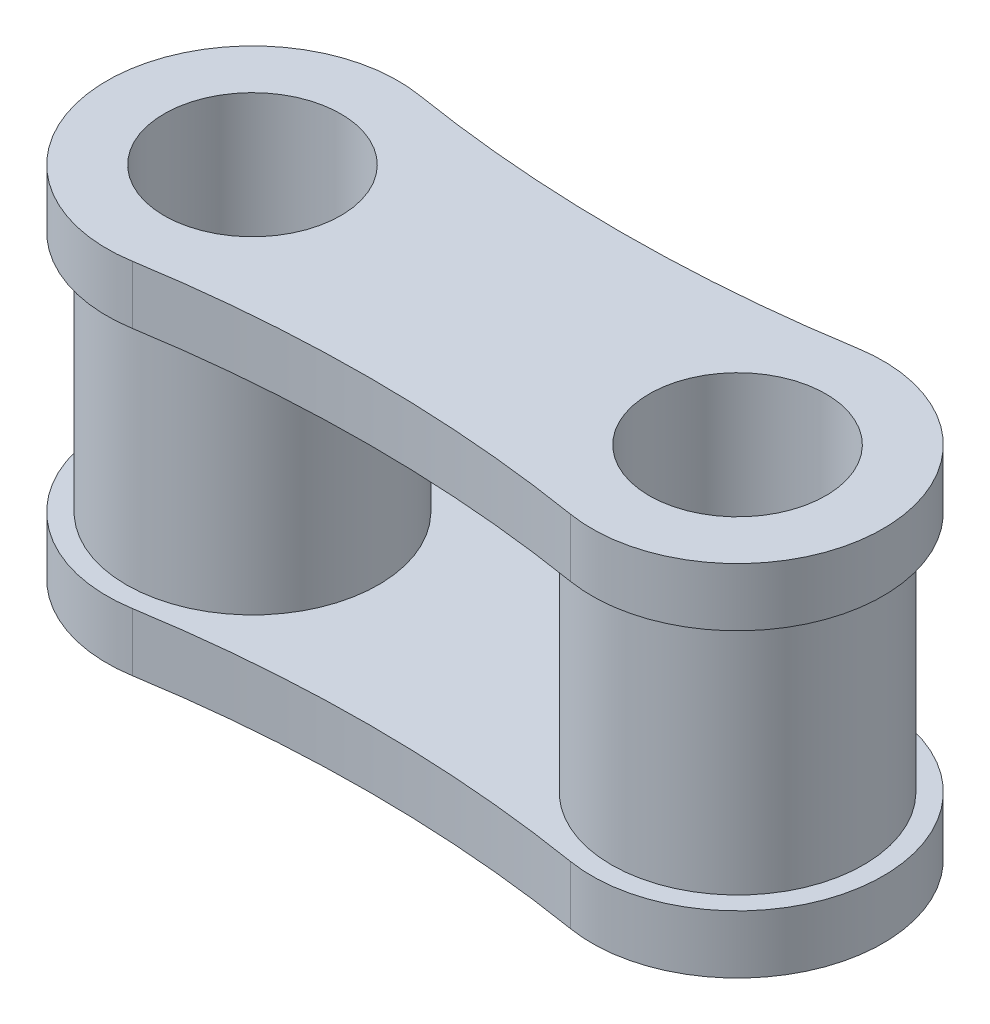
ISO-10303-21;
HEADER;
FILE_DESCRIPTION(('STEP AP214'),'2;1');
FILE_NAME('part.step','',(''),(''),'','','');
FILE_SCHEMA(('AUTOMOTIVE_DESIGN { 1 0 10303 214 1 1 1 1 }'));
ENDSEC;
DATA;
#1=APPLICATION_CONTEXT('core data for automotive mechanical design processes');
#2=APPLICATION_PROTOCOL_DEFINITION('international standard','automotive_design',2000,#1);
#3=PRODUCT_CONTEXT('',#1,'mechanical');
#4=PRODUCT('Part','Part','',(#3));
#5=PRODUCT_RELATED_PRODUCT_CATEGORY('part','',(#4));
#6=PRODUCT_DEFINITION_FORMATION('','',#4);
#7=PRODUCT_DEFINITION_CONTEXT('part definition',#1,'design');
#8=PRODUCT_DEFINITION('design','',#6,#7);
#9=PRODUCT_DEFINITION_SHAPE('','',#8);
#10=(LENGTH_UNIT() NAMED_UNIT(*) SI_UNIT(.MILLI.,.METRE.));
#11=(NAMED_UNIT(*) PLANE_ANGLE_UNIT() SI_UNIT($,.RADIAN.));
#12=(NAMED_UNIT(*) SI_UNIT($,.STERADIAN.) SOLID_ANGLE_UNIT());
#13=UNCERTAINTY_MEASURE_WITH_UNIT(LENGTH_MEASURE(1.E-05),#10,'distance_accuracy_value','');
#14=(GEOMETRIC_REPRESENTATION_CONTEXT(3) GLOBAL_UNCERTAINTY_ASSIGNED_CONTEXT((#13)) GLOBAL_UNIT_ASSIGNED_CONTEXT((#10,
#11,#12)) REPRESENTATION_CONTEXT('',''));
#15=CARTESIAN_POINT('',(0.,0.,0.));
#16=DIRECTION('',(0.,0.,1.));
#17=DIRECTION('',(1.,0.,0.));
#18=AXIS2_PLACEMENT_3D('',#15,#16,#17);
#19=CARTESIAN_POINT('',(0.,0.762,19.4272643467885));
#20=DIRECTION('',(0.,-1.,0.));
#21=DIRECTION('',(0.,0.,-1.));
#22=AXIS2_PLACEMENT_3D('',#19,#20,#21);
#23=CYLINDRICAL_SURFACE('',#22,17.78);
#24=CARTESIAN_POINT('',(0.,0.,19.4272643467885));
#25=DIRECTION('',(0.,-1.,0.));
#26=DIRECTION('',(0.,0.,1.));
#27=AXIS2_PLACEMENT_3D('',#24,#25,#26);
#28=CIRCLE('',#27,17.78);
#29=CARTESIAN_POINT('',(-2.86774193548387,0.,1.88005784001179));
#30=VERTEX_POINT('',#29);
#31=CARTESIAN_POINT('',(2.86774193548387,0.,1.88005784001179));
#32=VERTEX_POINT('',#31);
#33=EDGE_CURVE('E162',#30,#32,#28,.T.);
#34=ORIENTED_EDGE('',*,*,#33,.T.);
#35=DIRECTION('',(0.,-1.,0.));
#36=VECTOR('',#35,1.);
#37=CARTESIAN_POINT('',(2.86774193548387,0.762,1.88005784001179));
#38=LINE('',#37,#36);
#39=CARTESIAN_POINT('',(2.86774193548387,0.762,1.88005784001179));
#40=VERTEX_POINT('',#39);
#41=EDGE_CURVE('E11',#40,#32,#38,.T.);
#42=ORIENTED_EDGE('',*,*,#41,.F.);
#43=CARTESIAN_POINT('',(0.,0.762,19.4272643467885));
#44=DIRECTION('',(0.,-1.,0.));
#45=DIRECTION('',(0.,0.,1.));
#46=AXIS2_PLACEMENT_3D('',#43,#44,#45);
#47=CIRCLE('',#46,17.78);
#48=CARTESIAN_POINT('',(-2.86774193548387,0.762,1.88005784001179));
#49=VERTEX_POINT('',#48);
#50=EDGE_CURVE('E166',#49,#40,#47,.T.);
#51=ORIENTED_EDGE('',*,*,#50,.F.);
#52=DIRECTION('',(0.,-1.,0.));
#53=VECTOR('',#52,1.);
#54=CARTESIAN_POINT('',(-2.86774193548387,0.762,1.88005784001179));
#55=LINE('',#54,#53);
#56=EDGE_CURVE('E176',#49,#30,#55,.T.);
#57=ORIENTED_EDGE('',*,*,#56,.T.);
#58=EDGE_LOOP('',(#34,#42,#51,#57));
#59=FACE_BOUND('',#58,.T.);
#60=ADVANCED_FACE('F40',(#59),#23,.F.);
#61=CARTESIAN_POINT('',(3.175,0.762,0.));
#62=DIRECTION('',(0.,-1.,0.));
#63=DIRECTION('',(0.,0.,-1.));
#64=AXIS2_PLACEMENT_3D('',#61,#62,#63);
#65=CYLINDRICAL_SURFACE('',#64,1.905);
#66=CARTESIAN_POINT('',(3.175,0.,0.));
#67=DIRECTION('',(0.,1.,0.));
#68=DIRECTION('',(0.,0.,1.));
#69=AXIS2_PLACEMENT_3D('',#66,#67,#68);
#70=CIRCLE('',#69,1.905);
#71=CARTESIAN_POINT('',(2.86774193548387,0.,-1.88005784001179));
#72=VERTEX_POINT('',#71);
#73=EDGE_CURVE('E180',#32,#72,#70,.T.);
#74=ORIENTED_EDGE('',*,*,#73,.T.);
#75=DIRECTION('',(0.,-1.,0.));
#76=VECTOR('',#75,1.);
#77=CARTESIAN_POINT('',(2.86774193548387,0.762,-1.88005784001179));
#78=LINE('',#77,#76);
#79=CARTESIAN_POINT('',(2.86774193548387,0.762,-1.88005784001179));
#80=VERTEX_POINT('',#79);
#81=EDGE_CURVE('E49',#80,#72,#78,.T.);
#82=ORIENTED_EDGE('',*,*,#81,.F.);
#83=CARTESIAN_POINT('',(3.175,0.762,0.));
#84=DIRECTION('',(0.,1.,0.));
#85=DIRECTION('',(0.,0.,1.));
#86=AXIS2_PLACEMENT_3D('',#83,#84,#85);
#87=CIRCLE('',#86,1.905);
#88=EDGE_CURVE('E88',#40,#80,#87,.T.);
#89=ORIENTED_EDGE('',*,*,#88,.F.);
#90=ORIENTED_EDGE('',*,*,#41,.T.);
#91=EDGE_LOOP('',(#74,#82,#89,#90));
#92=FACE_BOUND('',#91,.T.);
#93=ADVANCED_FACE('F210',(#92),#65,.T.);
#94=CARTESIAN_POINT('',(0.,0.762,-19.4272643467885));
#95=DIRECTION('',(0.,-1.,0.));
#96=DIRECTION('',(0.,0.,-1.));
#97=AXIS2_PLACEMENT_3D('',#94,#95,#96);
#98=CYLINDRICAL_SURFACE('',#97,17.78);
#99=CARTESIAN_POINT('',(0.,0.,-19.4272643467885));
#100=DIRECTION('',(0.,-1.,0.));
#101=DIRECTION('',(0.,0.,1.));
#102=AXIS2_PLACEMENT_3D('',#99,#100,#101);
#103=CIRCLE('',#102,17.78);
#104=CARTESIAN_POINT('',(-2.86774193548387,0.,-1.88005784001179));
#105=VERTEX_POINT('',#104);
#106=EDGE_CURVE('E75',#72,#105,#103,.T.);
#107=ORIENTED_EDGE('',*,*,#106,.T.);
#108=DIRECTION('',(0.,-1.,0.));
#109=VECTOR('',#108,1.);
#110=CARTESIAN_POINT('',(-2.86774193548387,0.762,-1.88005784001179));
#111=LINE('',#110,#109);
#112=CARTESIAN_POINT('',(-2.86774193548387,0.762,-1.88005784001179));
#113=VERTEX_POINT('',#112);
#114=EDGE_CURVE('E189',#113,#105,#111,.T.);
#115=ORIENTED_EDGE('',*,*,#114,.F.);
#116=CARTESIAN_POINT('',(0.,0.762,-19.4272643467885));
#117=DIRECTION('',(0.,-1.,0.));
#118=DIRECTION('',(0.,0.,1.));
#119=AXIS2_PLACEMENT_3D('',#116,#117,#118);
#120=CIRCLE('',#119,17.78);
#121=EDGE_CURVE('E171',#80,#113,#120,.T.);
#122=ORIENTED_EDGE('',*,*,#121,.F.);
#123=ORIENTED_EDGE('',*,*,#81,.T.);
#124=EDGE_LOOP('',(#107,#115,#122,#123));
#125=FACE_BOUND('',#124,.T.);
#126=ADVANCED_FACE('F193',(#125),#98,.F.);
#127=CARTESIAN_POINT('',(-3.175,0.762,0.));
#128=DIRECTION('',(0.,-1.,0.));
#129=DIRECTION('',(0.,0.,-1.));
#130=AXIS2_PLACEMENT_3D('',#127,#128,#129);
#131=CYLINDRICAL_SURFACE('',#130,1.905);
#132=CARTESIAN_POINT('',(-3.175,0.,0.));
#133=DIRECTION('',(0.,1.,0.));
#134=DIRECTION('',(0.,0.,1.));
#135=AXIS2_PLACEMENT_3D('',#132,#133,#134);
#136=CIRCLE('',#135,1.905);
#137=EDGE_CURVE('E81',#105,#30,#136,.T.);
#138=ORIENTED_EDGE('',*,*,#137,.T.);
#139=ORIENTED_EDGE('',*,*,#56,.F.);
#140=CARTESIAN_POINT('',(-3.175,0.762,0.));
#141=DIRECTION('',(0.,1.,0.));
#142=DIRECTION('',(0.,0.,1.));
#143=AXIS2_PLACEMENT_3D('',#140,#141,#142);
#144=CIRCLE('',#143,1.905);
#145=EDGE_CURVE('E57',#113,#49,#144,.T.);
#146=ORIENTED_EDGE('',*,*,#145,.F.);
#147=ORIENTED_EDGE('',*,*,#114,.T.);
#148=EDGE_LOOP('',(#138,#139,#146,#147));
#149=FACE_BOUND('',#148,.T.);
#150=ADVANCED_FACE('F200',(#149),#131,.T.);
#151=CARTESIAN_POINT('',(-1.5875,0.762,9.71363217339425));
#152=DIRECTION('',(0.,1.,0.));
#153=DIRECTION('',(0.,0.,1.));
#154=AXIS2_PLACEMENT_3D('',#151,#152,#153);
#155=PLANE('',#154);
#156=CARTESIAN_POINT('',(3.175,0.762,0.));
#157=DIRECTION('',(0.,1.,0.));
#158=DIRECTION('',(0.,0.,1.));
#159=AXIS2_PLACEMENT_3D('',#156,#157,#158);
#160=CIRCLE('',#159,1.651);
#161=CARTESIAN_POINT('',(3.175,0.762,1.651));
#162=VERTEX_POINT('',#161);
#163=EDGE_CURVE('E143',#162,#162,#160,.T.);
#164=ORIENTED_EDGE('',*,*,#163,.F.);
#165=EDGE_LOOP('',(#164));
#166=FACE_BOUND('',#165,.T.);
#167=CARTESIAN_POINT('',(-3.175,0.762,0.));
#168=DIRECTION('',(0.,1.,0.));
#169=DIRECTION('',(0.,0.,1.));
#170=AXIS2_PLACEMENT_3D('',#167,#168,#169);
#171=CIRCLE('',#170,1.651);
#172=CARTESIAN_POINT('',(-3.175,0.762,1.651));
#173=VERTEX_POINT('',#172);
#174=EDGE_CURVE('E156',#173,#173,#171,.T.);
#175=ORIENTED_EDGE('',*,*,#174,.F.);
#176=EDGE_LOOP('',(#175));
#177=FACE_BOUND('',#176,.T.);
#178=ORIENTED_EDGE('',*,*,#50,.T.);
#179=ORIENTED_EDGE('',*,*,#88,.T.);
#180=ORIENTED_EDGE('',*,*,#121,.T.);
#181=ORIENTED_EDGE('',*,*,#145,.T.);
#182=EDGE_LOOP('',(#178,#179,#180,#181));
#183=FACE_BOUND('',#182,.T.);
#184=ADVANCED_FACE('F202',(#166,#177,#183),#155,.T.);
#185=CARTESIAN_POINT('',(-1.5875,0.,9.71363217339425));
#186=DIRECTION('',(0.,1.,0.));
#187=DIRECTION('',(0.,0.,1.));
#188=AXIS2_PLACEMENT_3D('',#185,#186,#187);
#189=PLANE('',#188);
#190=CARTESIAN_POINT('',(3.175,0.,0.));
#191=DIRECTION('',(0.,1.,0.));
#192=DIRECTION('',(0.,0.,1.));
#193=AXIS2_PLACEMENT_3D('',#190,#191,#192);
#194=CIRCLE('',#193,1.1557);
#195=CARTESIAN_POINT('',(3.175,0.,1.1557));
#196=VERTEX_POINT('',#195);
#197=EDGE_CURVE('E358',#196,#196,#194,.T.);
#198=ORIENTED_EDGE('',*,*,#197,.T.);
#199=EDGE_LOOP('',(#198));
#200=FACE_BOUND('',#199,.T.);
#201=CARTESIAN_POINT('',(-3.175,0.,0.));
#202=DIRECTION('',(0.,1.,0.));
#203=DIRECTION('',(0.,0.,1.));
#204=AXIS2_PLACEMENT_3D('',#201,#202,#203);
#205=CIRCLE('',#204,1.1557);
#206=CARTESIAN_POINT('',(-3.175,0.,1.1557));
#207=VERTEX_POINT('',#206);
#208=EDGE_CURVE('E350',#207,#207,#205,.T.);
#209=ORIENTED_EDGE('',*,*,#208,.T.);
#210=EDGE_LOOP('',(#209));
#211=FACE_BOUND('',#210,.T.);
#212=ORIENTED_EDGE('',*,*,#33,.F.);
#213=ORIENTED_EDGE('',*,*,#137,.F.);
#214=ORIENTED_EDGE('',*,*,#106,.F.);
#215=ORIENTED_EDGE('',*,*,#73,.F.);
#216=EDGE_LOOP('',(#212,#213,#214,#215));
#217=FACE_BOUND('',#216,.T.);
#218=ADVANCED_FACE('F196',(#200,#211,#217),#189,.F.);
#219=CARTESIAN_POINT('',(-3.175,3.937,0.));
#220=DIRECTION('',(0.,-1.,0.));
#221=DIRECTION('',(0.,0.,-1.));
#222=AXIS2_PLACEMENT_3D('',#219,#220,#221);
#223=CYLINDRICAL_SURFACE('',#222,1.651);
#224=CARTESIAN_POINT('',(-3.175,3.937,0.));
#225=DIRECTION('',(0.,1.,0.));
#226=DIRECTION('',(0.,0.,1.));
#227=AXIS2_PLACEMENT_3D('',#224,#225,#226);
#228=CIRCLE('',#227,1.651);
#229=CARTESIAN_POINT('',(-3.175,3.937,1.651));
#230=VERTEX_POINT('',#229);
#231=EDGE_CURVE('E158',#230,#230,#228,.T.);
#232=ORIENTED_EDGE('',*,*,#231,.F.);
#233=EDGE_LOOP('',(#232));
#234=FACE_BOUND('',#233,.T.);
#235=ORIENTED_EDGE('',*,*,#174,.T.);
#236=EDGE_LOOP('',(#235));
#237=FACE_BOUND('',#236,.T.);
#238=ADVANCED_FACE('F240',(#234,#237),#223,.T.);
#239=CARTESIAN_POINT('',(3.175,3.937,0.));
#240=DIRECTION('',(0.,-1.,0.));
#241=DIRECTION('',(0.,0.,-1.));
#242=AXIS2_PLACEMENT_3D('',#239,#240,#241);
#243=CYLINDRICAL_SURFACE('',#242,1.651);
#244=CARTESIAN_POINT('',(3.175,3.937,0.));
#245=DIRECTION('',(0.,1.,0.));
#246=DIRECTION('',(0.,0.,1.));
#247=AXIS2_PLACEMENT_3D('',#244,#245,#246);
#248=CIRCLE('',#247,1.651);
#249=CARTESIAN_POINT('',(3.175,3.937,1.651));
#250=VERTEX_POINT('',#249);
#251=EDGE_CURVE('E148',#250,#250,#248,.T.);
#252=ORIENTED_EDGE('',*,*,#251,.F.);
#253=EDGE_LOOP('',(#252));
#254=FACE_BOUND('',#253,.T.);
#255=ORIENTED_EDGE('',*,*,#163,.T.);
#256=EDGE_LOOP('',(#255));
#257=FACE_BOUND('',#256,.T.);
#258=ADVANCED_FACE('F245',(#254,#257),#243,.T.);
#259=CARTESIAN_POINT('',(1.5875,3.937,-9.71363217339425));
#260=DIRECTION('',(0.,1.,0.));
#261=DIRECTION('',(0.,0.,1.));
#262=AXIS2_PLACEMENT_3D('',#259,#260,#261);
#263=PLANE('',#262);
#264=ORIENTED_EDGE('',*,*,#231,.T.);
#265=EDGE_LOOP('',(#264));
#266=FACE_BOUND('',#265,.T.);
#267=ORIENTED_EDGE('',*,*,#251,.T.);
#268=EDGE_LOOP('',(#267));
#269=FACE_BOUND('',#268,.T.);
#270=CARTESIAN_POINT('',(3.175,3.937,0.));
#271=DIRECTION('',(0.,1.,0.));
#272=DIRECTION('',(0.,0.,1.));
#273=AXIS2_PLACEMENT_3D('',#270,#271,#272);
#274=CIRCLE('',#273,1.905);
#275=CARTESIAN_POINT('',(2.86774193548387,3.937,1.88005784001179));
#276=VERTEX_POINT('',#275);
#277=CARTESIAN_POINT('',(2.86774193548387,3.937,-1.88005784001179));
#278=VERTEX_POINT('',#277);
#279=EDGE_CURVE('E141',#276,#278,#274,.T.);
#280=ORIENTED_EDGE('',*,*,#279,.F.);
#281=CARTESIAN_POINT('',(0.,3.937,19.4272643467885));
#282=DIRECTION('',(0.,-1.,0.));
#283=DIRECTION('',(0.,0.,1.));
#284=AXIS2_PLACEMENT_3D('',#281,#282,#283);
#285=CIRCLE('',#284,17.78);
#286=CARTESIAN_POINT('',(-2.86774193548387,3.937,1.88005784001179));
#287=VERTEX_POINT('',#286);
#288=EDGE_CURVE('E137',#287,#276,#285,.T.);
#289=ORIENTED_EDGE('',*,*,#288,.F.);
#290=CARTESIAN_POINT('',(-3.175,3.937,0.));
#291=DIRECTION('',(0.,1.,0.));
#292=DIRECTION('',(0.,0.,1.));
#293=AXIS2_PLACEMENT_3D('',#290,#291,#292);
#294=CIRCLE('',#293,1.905);
#295=CARTESIAN_POINT('',(-2.86774193548387,3.937,-1.88005784001179));
#296=VERTEX_POINT('',#295);
#297=EDGE_CURVE('E373',#296,#287,#294,.T.);
#298=ORIENTED_EDGE('',*,*,#297,.F.);
#299=CARTESIAN_POINT('',(0.,3.937,-19.4272643467885));
#300=DIRECTION('',(0.,-1.,0.));
#301=DIRECTION('',(0.,0.,1.));
#302=AXIS2_PLACEMENT_3D('',#299,#300,#301);
#303=CIRCLE('',#302,17.78);
#304=EDGE_CURVE('E370',#278,#296,#303,.T.);
#305=ORIENTED_EDGE('',*,*,#304,.F.);
#306=EDGE_LOOP('',(#280,#289,#298,#305));
#307=FACE_BOUND('',#306,.T.);
#308=ADVANCED_FACE('F256',(#266,#269,#307),#263,.F.);
#309=CARTESIAN_POINT('',(1.5875,4.699,-9.71363217339425));
#310=DIRECTION('',(0.,1.,0.));
#311=DIRECTION('',(0.,0.,1.));
#312=AXIS2_PLACEMENT_3D('',#309,#310,#311);
#313=PLANE('',#312);
#314=CARTESIAN_POINT('',(3.175,4.699,0.));
#315=DIRECTION('',(0.,1.,0.));
#316=DIRECTION('',(0.,0.,1.));
#317=AXIS2_PLACEMENT_3D('',#314,#315,#316);
#318=CIRCLE('',#317,1.1557);
#319=CARTESIAN_POINT('',(3.175,4.699,1.1557));
#320=VERTEX_POINT('',#319);
#321=EDGE_CURVE('E353',#320,#320,#318,.T.);
#322=ORIENTED_EDGE('',*,*,#321,.F.);
#323=EDGE_LOOP('',(#322));
#324=FACE_BOUND('',#323,.T.);
#325=CARTESIAN_POINT('',(-3.175,4.699,0.));
#326=DIRECTION('',(0.,1.,0.));
#327=DIRECTION('',(0.,0.,1.));
#328=AXIS2_PLACEMENT_3D('',#325,#326,#327);
#329=CIRCLE('',#328,1.1557);
#330=CARTESIAN_POINT('',(-3.175,4.699,1.1557));
#331=VERTEX_POINT('',#330);
#332=EDGE_CURVE('E347',#331,#331,#329,.T.);
#333=ORIENTED_EDGE('',*,*,#332,.F.);
#334=EDGE_LOOP('',(#333));
#335=FACE_BOUND('',#334,.T.);
#336=CARTESIAN_POINT('',(3.175,4.699,0.));
#337=DIRECTION('',(0.,1.,0.));
#338=DIRECTION('',(0.,0.,1.));
#339=AXIS2_PLACEMENT_3D('',#336,#337,#338);
#340=CIRCLE('',#339,1.905);
#341=CARTESIAN_POINT('',(2.86774193548387,4.699,1.88005784001179));
#342=VERTEX_POINT('',#341);
#343=CARTESIAN_POINT('',(2.86774193548387,4.699,-1.88005784001179));
#344=VERTEX_POINT('',#343);
#345=EDGE_CURVE('E127',#342,#344,#340,.T.);
#346=ORIENTED_EDGE('',*,*,#345,.T.);
#347=CARTESIAN_POINT('',(0.,4.699,-19.4272643467885));
#348=DIRECTION('',(0.,-1.,0.));
#349=DIRECTION('',(0.,0.,1.));
#350=AXIS2_PLACEMENT_3D('',#347,#348,#349);
#351=CIRCLE('',#350,17.78);
#352=CARTESIAN_POINT('',(-2.86774193548387,4.699,-1.88005784001179));
#353=VERTEX_POINT('',#352);
#354=EDGE_CURVE('E115',#344,#353,#351,.T.);
#355=ORIENTED_EDGE('',*,*,#354,.T.);
#356=CARTESIAN_POINT('',(-3.175,4.699,0.));
#357=DIRECTION('',(0.,1.,0.));
#358=DIRECTION('',(0.,0.,1.));
#359=AXIS2_PLACEMENT_3D('',#356,#357,#358);
#360=CIRCLE('',#359,1.905);
#361=CARTESIAN_POINT('',(-2.86774193548387,4.699,1.88005784001179));
#362=VERTEX_POINT('',#361);
#363=EDGE_CURVE('E126',#353,#362,#360,.T.);
#364=ORIENTED_EDGE('',*,*,#363,.T.);
#365=CARTESIAN_POINT('',(0.,4.699,19.4272643467885));
#366=DIRECTION('',(0.,-1.,0.));
#367=DIRECTION('',(0.,0.,1.));
#368=AXIS2_PLACEMENT_3D('',#365,#366,#367);
#369=CIRCLE('',#368,17.78);
#370=EDGE_CURVE('E132',#362,#342,#369,.T.);
#371=ORIENTED_EDGE('',*,*,#370,.T.);
#372=EDGE_LOOP('',(#346,#355,#364,#371));
#373=FACE_BOUND('',#372,.T.);
#374=ADVANCED_FACE('F130',(#324,#335,#373),#313,.T.);
#375=CARTESIAN_POINT('',(0.,4.699,19.4272643467885));
#376=DIRECTION('',(0.,-1.,0.));
#377=DIRECTION('',(0.,0.,-1.));
#378=AXIS2_PLACEMENT_3D('',#375,#376,#377);
#379=CYLINDRICAL_SURFACE('',#378,17.78);
#380=ORIENTED_EDGE('',*,*,#288,.T.);
#381=DIRECTION('',(0.,-1.,0.));
#382=VECTOR('',#381,1.);
#383=CARTESIAN_POINT('',(2.86774193548387,4.699,1.88005784001179));
#384=LINE('',#383,#382);
#385=EDGE_CURVE('E367',#342,#276,#384,.T.);
#386=ORIENTED_EDGE('',*,*,#385,.F.);
#387=ORIENTED_EDGE('',*,*,#370,.F.);
#388=DIRECTION('',(0.,-1.,0.));
#389=VECTOR('',#388,1.);
#390=CARTESIAN_POINT('',(-2.86774193548387,4.699,1.88005784001179));
#391=LINE('',#390,#389);
#392=EDGE_CURVE('E150',#362,#287,#391,.T.);
#393=ORIENTED_EDGE('',*,*,#392,.T.);
#394=EDGE_LOOP('',(#380,#386,#387,#393));
#395=FACE_BOUND('',#394,.T.);
#396=ADVANCED_FACE('F274',(#395),#379,.F.);
#397=CARTESIAN_POINT('',(-3.175,4.699,0.));
#398=DIRECTION('',(0.,-1.,0.));
#399=DIRECTION('',(0.,0.,-1.));
#400=AXIS2_PLACEMENT_3D('',#397,#398,#399);
#401=CYLINDRICAL_SURFACE('',#400,1.905);
#402=ORIENTED_EDGE('',*,*,#297,.T.);
#403=ORIENTED_EDGE('',*,*,#392,.F.);
#404=ORIENTED_EDGE('',*,*,#363,.F.);
#405=DIRECTION('',(0.,-1.,0.));
#406=VECTOR('',#405,1.);
#407=CARTESIAN_POINT('',(-2.86774193548387,4.699,-1.88005784001179));
#408=LINE('',#407,#406);
#409=EDGE_CURVE('E122',#353,#296,#408,.T.);
#410=ORIENTED_EDGE('',*,*,#409,.T.);
#411=EDGE_LOOP('',(#402,#403,#404,#410));
#412=FACE_BOUND('',#411,.T.);
#413=ADVANCED_FACE('F279',(#412),#401,.T.);
#414=CARTESIAN_POINT('',(0.,4.699,-19.4272643467885));
#415=DIRECTION('',(0.,-1.,0.));
#416=DIRECTION('',(0.,0.,-1.));
#417=AXIS2_PLACEMENT_3D('',#414,#415,#416);
#418=CYLINDRICAL_SURFACE('',#417,17.78);
#419=ORIENTED_EDGE('',*,*,#304,.T.);
#420=ORIENTED_EDGE('',*,*,#409,.F.);
#421=ORIENTED_EDGE('',*,*,#354,.F.);
#422=DIRECTION('',(0.,-1.,0.));
#423=VECTOR('',#422,1.);
#424=CARTESIAN_POINT('',(2.86774193548387,4.699,-1.88005784001179));
#425=LINE('',#424,#423);
#426=EDGE_CURVE('E119',#344,#278,#425,.T.);
#427=ORIENTED_EDGE('',*,*,#426,.T.);
#428=EDGE_LOOP('',(#419,#420,#421,#427));
#429=FACE_BOUND('',#428,.T.);
#430=ADVANCED_FACE('F117',(#429),#418,.F.);
#431=CARTESIAN_POINT('',(3.175,4.699,0.));
#432=DIRECTION('',(0.,-1.,0.));
#433=DIRECTION('',(0.,0.,-1.));
#434=AXIS2_PLACEMENT_3D('',#431,#432,#433);
#435=CYLINDRICAL_SURFACE('',#434,1.905);
#436=ORIENTED_EDGE('',*,*,#279,.T.);
#437=ORIENTED_EDGE('',*,*,#426,.F.);
#438=ORIENTED_EDGE('',*,*,#345,.F.);
#439=ORIENTED_EDGE('',*,*,#385,.T.);
#440=EDGE_LOOP('',(#436,#437,#438,#439));
#441=FACE_BOUND('',#440,.T.);
#442=ADVANCED_FACE('F139',(#441),#435,.T.);
#443=CARTESIAN_POINT('',(3.175,3.937,0.));
#444=DIRECTION('',(0.,-1.,0.));
#445=DIRECTION('',(0.,0.,-1.));
#446=AXIS2_PLACEMENT_3D('',#443,#444,#445);
#447=CYLINDRICAL_SURFACE('',#446,1.1557);
#448=ORIENTED_EDGE('',*,*,#321,.T.);
#449=EDGE_LOOP('',(#448));
#450=FACE_BOUND('',#449,.T.);
#451=ORIENTED_EDGE('',*,*,#197,.F.);
#452=EDGE_LOOP('',(#451));
#453=FACE_BOUND('',#452,.T.);
#454=ADVANCED_FACE('F306',(#450,#453),#447,.F.);
#455=CARTESIAN_POINT('',(-3.175,3.937,0.));
#456=DIRECTION('',(0.,-1.,0.));
#457=DIRECTION('',(0.,0.,-1.));
#458=AXIS2_PLACEMENT_3D('',#455,#456,#457);
#459=CYLINDRICAL_SURFACE('',#458,1.1557);
#460=ORIENTED_EDGE('',*,*,#332,.T.);
#461=EDGE_LOOP('',(#460));
#462=FACE_BOUND('',#461,.T.);
#463=ORIENTED_EDGE('',*,*,#208,.F.);
#464=EDGE_LOOP('',(#463));
#465=FACE_BOUND('',#464,.T.);
#466=ADVANCED_FACE('F328',(#462,#465),#459,.F.);
#467=CLOSED_SHELL('',(#60,#93,#126,#150,#184,#218,#238,#258,#308,#374,#396,#413,#430,#442,#454,#466));
#468=MANIFOLD_SOLID_BREP('B2',#467);
#469=ADVANCED_BREP_SHAPE_REPRESENTATION('',(#18,#468),#14);
#470=SHAPE_DEFINITION_REPRESENTATION(#9,#469);
ENDSEC;
END-ISO-10303-21;
